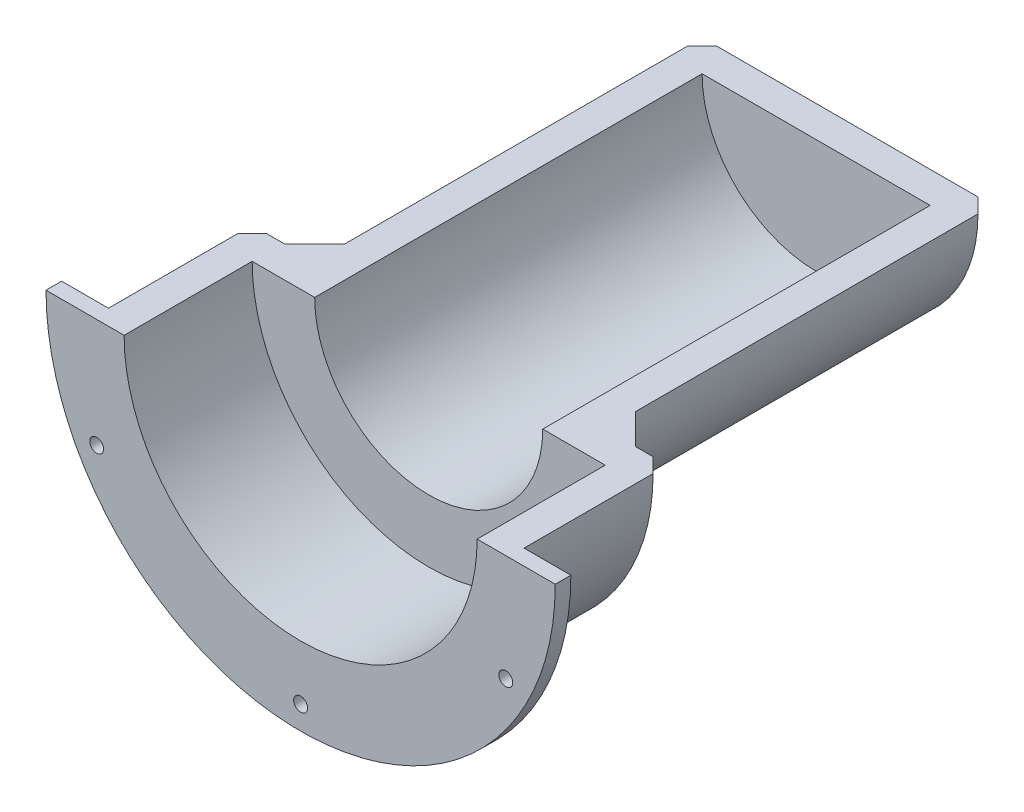
ISO-10303-21;
HEADER;
FILE_DESCRIPTION(('STEP AP214'),'2;1');
FILE_NAME('part.step','',(''),(''),'','','');
FILE_SCHEMA(('AUTOMOTIVE_DESIGN { 1 0 10303 214 1 1 1 1 }'));
ENDSEC;
DATA;
#1=APPLICATION_CONTEXT('core data for automotive mechanical design processes');
#2=APPLICATION_PROTOCOL_DEFINITION('international standard','automotive_design',2000,#1);
#3=PRODUCT_CONTEXT('',#1,'mechanical');
#4=PRODUCT('Part','Part','',(#3));
#5=PRODUCT_RELATED_PRODUCT_CATEGORY('part','',(#4));
#6=PRODUCT_DEFINITION_FORMATION('','',#4);
#7=PRODUCT_DEFINITION_CONTEXT('part definition',#1,'design');
#8=PRODUCT_DEFINITION('design','',#6,#7);
#9=PRODUCT_DEFINITION_SHAPE('','',#8);
#10=(LENGTH_UNIT() NAMED_UNIT(*) SI_UNIT(.MILLI.,.METRE.));
#11=(NAMED_UNIT(*) PLANE_ANGLE_UNIT() SI_UNIT($,.RADIAN.));
#12=(NAMED_UNIT(*) SI_UNIT($,.STERADIAN.) SOLID_ANGLE_UNIT());
#13=UNCERTAINTY_MEASURE_WITH_UNIT(LENGTH_MEASURE(1.E-05),#10,'distance_accuracy_value','');
#14=(GEOMETRIC_REPRESENTATION_CONTEXT(3) GLOBAL_UNCERTAINTY_ASSIGNED_CONTEXT((#13)) GLOBAL_UNIT_ASSIGNED_CONTEXT((#10,
#11,#12)) REPRESENTATION_CONTEXT('',''));
#15=CARTESIAN_POINT('',(0.,0.,0.));
#16=DIRECTION('',(0.,0.,1.));
#17=DIRECTION('',(1.,0.,0.));
#18=AXIS2_PLACEMENT_3D('',#15,#16,#17);
#19=CARTESIAN_POINT('',(0.,0.,25.908));
#20=DIRECTION('',(0.,0.,-1.));
#21=DIRECTION('',(-1.,0.,0.));
#22=AXIS2_PLACEMENT_3D('',#19,#20,#21);
#23=CYLINDRICAL_SURFACE('',#22,33.782);
#24=DIRECTION('',(0.,0.,-1.));
#25=VECTOR('',#24,1.);
#26=CARTESIAN_POINT('',(-33.782,0.,25.908));
#27=LINE('',#26,#25);
#28=CARTESIAN_POINT('',(-33.782,0.,23.368));
#29=VERTEX_POINT('',#28);
#30=CARTESIAN_POINT('',(-33.782,0.,2.38000000000003));
#31=VERTEX_POINT('',#30);
#32=EDGE_CURVE('E188',#29,#31,#27,.T.);
#33=ORIENTED_EDGE('',*,*,#32,.T.);
#34=CARTESIAN_POINT('',(0.,0.,2.38000000000003));
#35=DIRECTION('',(0.,0.,1.));
#36=DIRECTION('',(1.,0.,0.));
#37=AXIS2_PLACEMENT_3D('',#34,#35,#36);
#38=CIRCLE('',#37,33.782);
#39=CARTESIAN_POINT('',(33.782,0.,2.38000000000003));
#40=VERTEX_POINT('',#39);
#41=EDGE_CURVE('E259',#31,#40,#38,.T.);
#42=ORIENTED_EDGE('',*,*,#41,.T.);
#43=DIRECTION('',(0.,0.,-1.));
#44=VECTOR('',#43,1.);
#45=CARTESIAN_POINT('',(33.782,0.,25.908));
#46=LINE('',#45,#44);
#47=CARTESIAN_POINT('',(33.782,0.,23.368));
#48=VERTEX_POINT('',#47);
#49=EDGE_CURVE('E194',#48,#40,#46,.T.);
#50=ORIENTED_EDGE('',*,*,#49,.F.);
#51=CARTESIAN_POINT('',(0.,0.,23.368));
#52=DIRECTION('',(0.,0.,1.));
#53=DIRECTION('',(1.,0.,0.));
#54=AXIS2_PLACEMENT_3D('',#51,#52,#53);
#55=CIRCLE('',#54,33.782);
#56=EDGE_CURVE('E273',#29,#48,#55,.T.);
#57=ORIENTED_EDGE('',*,*,#56,.F.);
#58=EDGE_LOOP('',(#33,#42,#50,#57));
#59=FACE_BOUND('',#58,.T.);
#60=ADVANCED_FACE('F67',(#59),#23,.T.);
#61=CARTESIAN_POINT('',(0.,0.,5.08));
#62=DIRECTION('',(0.,0.,1.));
#63=DIRECTION('',(1.,0.,0.));
#64=AXIS2_PLACEMENT_3D('',#61,#62,#63);
#65=CYLINDRICAL_SURFACE('',#64,28.702);
#66=DIRECTION('',(0.,0.,1.));
#67=VECTOR('',#66,1.);
#68=CARTESIAN_POINT('',(-28.702,0.,5.08));
#69=LINE('',#68,#67);
#70=CARTESIAN_POINT('',(-28.702,0.,5.08));
#71=VERTEX_POINT('',#70);
#72=CARTESIAN_POINT('',(-28.702,0.,25.908));
#73=VERTEX_POINT('',#72);
#74=EDGE_CURVE('E172',#71,#73,#69,.T.);
#75=ORIENTED_EDGE('',*,*,#74,.T.);
#76=CARTESIAN_POINT('',(0.,0.,25.908));
#77=DIRECTION('',(0.,0.,1.));
#78=DIRECTION('',(1.,0.,0.));
#79=AXIS2_PLACEMENT_3D('',#76,#77,#78);
#80=CIRCLE('',#79,28.702);
#81=CARTESIAN_POINT('',(28.702,0.,25.908));
#82=VERTEX_POINT('',#81);
#83=EDGE_CURVE('E175',#73,#82,#80,.T.);
#84=ORIENTED_EDGE('',*,*,#83,.T.);
#85=DIRECTION('',(0.,0.,1.));
#86=VECTOR('',#85,1.);
#87=CARTESIAN_POINT('',(28.702,0.,5.08));
#88=LINE('',#87,#86);
#89=CARTESIAN_POINT('',(28.702,0.,5.08));
#90=VERTEX_POINT('',#89);
#91=EDGE_CURVE('E160',#90,#82,#88,.T.);
#92=ORIENTED_EDGE('',*,*,#91,.F.);
#93=CARTESIAN_POINT('',(0.,0.,5.08));
#94=DIRECTION('',(0.,0.,1.));
#95=DIRECTION('',(1.,0.,0.));
#96=AXIS2_PLACEMENT_3D('',#93,#94,#95);
#97=CIRCLE('',#96,28.702);
#98=EDGE_CURVE('E343',#71,#90,#97,.T.);
#99=ORIENTED_EDGE('',*,*,#98,.F.);
#100=EDGE_LOOP('',(#75,#84,#92,#99));
#101=FACE_BOUND('',#100,.T.);
#102=ADVANCED_FACE('F176',(#101),#65,.F.);
#103=CARTESIAN_POINT('',(0.,0.,-57.912));
#104=DIRECTION('',(0.,0.,1.));
#105=DIRECTION('',(1.,0.,0.));
#106=AXIS2_PLACEMENT_3D('',#103,#104,#105);
#107=CYLINDRICAL_SURFACE('',#106,18.542);
#108=CARTESIAN_POINT('',(0.,0.,5.08));
#109=DIRECTION('',(0.,0.,1.));
#110=DIRECTION('',(1.,0.,0.));
#111=AXIS2_PLACEMENT_3D('',#108,#109,#110);
#112=CIRCLE('',#111,18.542);
#113=CARTESIAN_POINT('',(18.542,0.,5.08));
#114=VERTEX_POINT('',#113);
#115=CARTESIAN_POINT('',(-18.542,0.,5.08));
#116=VERTEX_POINT('',#115);
#117=EDGE_CURVE('E226',#114,#116,#112,.F.);
#118=ORIENTED_EDGE('',*,*,#117,.F.);
#119=DIRECTION('',(0.,0.,1.));
#120=VECTOR('',#119,1.);
#121=CARTESIAN_POINT('',(18.542,0.,-57.912));
#122=LINE('',#121,#120);
#123=CARTESIAN_POINT('',(18.542,0.,-57.912));
#124=VERTEX_POINT('',#123);
#125=EDGE_CURVE('E211',#124,#114,#122,.T.);
#126=ORIENTED_EDGE('',*,*,#125,.F.);
#127=CARTESIAN_POINT('',(0.,0.,-57.912));
#128=DIRECTION('',(0.,0.,1.));
#129=DIRECTION('',(1.,0.,0.));
#130=AXIS2_PLACEMENT_3D('',#127,#128,#129);
#131=CIRCLE('',#130,18.542);
#132=CARTESIAN_POINT('',(-18.542,0.,-57.912));
#133=VERTEX_POINT('',#132);
#134=EDGE_CURVE('E204',#133,#124,#131,.T.);
#135=ORIENTED_EDGE('',*,*,#134,.F.);
#136=DIRECTION('',(0.,0.,1.));
#137=VECTOR('',#136,1.);
#138=CARTESIAN_POINT('',(-18.542,0.,-57.912));
#139=LINE('',#138,#137);
#140=EDGE_CURVE('E212',#133,#116,#139,.T.);
#141=ORIENTED_EDGE('',*,*,#140,.T.);
#142=EDGE_LOOP('',(#118,#126,#135,#141));
#143=FACE_BOUND('',#142,.T.);
#144=ADVANCED_FACE('F293',(#143),#107,.F.);
#145=CARTESIAN_POINT('',(0.,0.,-62.992));
#146=DIRECTION('',(0.,0.,1.));
#147=DIRECTION('',(1.,0.,0.));
#148=AXIS2_PLACEMENT_3D('',#145,#146,#147);
#149=CYLINDRICAL_SURFACE('',#148,23.622);
#150=DIRECTION('',(0.,0.,1.));
#151=VECTOR('',#150,1.);
#152=CARTESIAN_POINT('',(-23.622,0.,-62.992));
#153=LINE('',#152,#151);
#154=CARTESIAN_POINT('',(-23.622,0.,-60.612));
#155=VERTEX_POINT('',#154);
#156=CARTESIAN_POINT('',(-23.622,0.,-4.92000000000005));
#157=VERTEX_POINT('',#156);
#158=EDGE_CURVE('E222',#155,#157,#153,.T.);
#159=ORIENTED_EDGE('',*,*,#158,.F.);
#160=CARTESIAN_POINT('',(0.,0.,-60.612));
#161=DIRECTION('',(0.,0.,1.));
#162=DIRECTION('',(1.,0.,0.));
#163=AXIS2_PLACEMENT_3D('',#160,#161,#162);
#164=CIRCLE('',#163,23.622);
#165=CARTESIAN_POINT('',(23.622,0.,-60.612));
#166=VERTEX_POINT('',#165);
#167=EDGE_CURVE('E246',#155,#166,#164,.T.);
#168=ORIENTED_EDGE('',*,*,#167,.T.);
#169=DIRECTION('',(0.,0.,1.));
#170=VECTOR('',#169,1.);
#171=CARTESIAN_POINT('',(23.622,0.,-62.992));
#172=LINE('',#171,#170);
#173=CARTESIAN_POINT('',(23.622,0.,-4.92000000000005));
#174=VERTEX_POINT('',#173);
#175=EDGE_CURVE('E223',#166,#174,#172,.T.);
#176=ORIENTED_EDGE('',*,*,#175,.T.);
#177=CARTESIAN_POINT('',(0.,0.,-4.92000000000005));
#178=DIRECTION('',(0.,0.,1.));
#179=DIRECTION('',(1.,0.,0.));
#180=AXIS2_PLACEMENT_3D('',#177,#178,#179);
#181=CIRCLE('',#180,23.622);
#182=EDGE_CURVE('E235',#174,#157,#181,.F.);
#183=ORIENTED_EDGE('',*,*,#182,.T.);
#184=EDGE_LOOP('',(#159,#168,#176,#183));
#185=FACE_BOUND('',#184,.T.);
#186=ADVANCED_FACE('F306',(#185),#149,.T.);
#187=CARTESIAN_POINT('',(0.,0.,-62.992));
#188=DIRECTION('',(0.,-1.,0.));
#189=DIRECTION('',(0.,0.,-1.));
#190=AXIS2_PLACEMENT_3D('',#187,#188,#189);
#191=PLANE('',#190);
#192=ORIENTED_EDGE('',*,*,#49,.T.);
#193=DIRECTION('',(0.70710678118655,0.,0.707106781186545));
#194=VECTOR('',#193,1.);
#195=CARTESIAN_POINT('',(0.,0.,-31.4019999999998));
#196=LINE('',#195,#194);
#197=CARTESIAN_POINT('',(31.402,0.,0.));
#198=VERTEX_POINT('',#197);
#199=EDGE_CURVE('E77',#40,#198,#196,.F.);
#200=ORIENTED_EDGE('',*,*,#199,.T.);
#201=DIRECTION('',(-1.,0.,0.));
#202=VECTOR('',#201,1.);
#203=CARTESIAN_POINT('',(-33.782,0.,0.));
#204=LINE('',#203,#202);
#205=CARTESIAN_POINT('',(28.542,0.,0.));
#206=VERTEX_POINT('',#205);
#207=EDGE_CURVE('E196',#198,#206,#204,.T.);
#208=ORIENTED_EDGE('',*,*,#207,.T.);
#209=DIRECTION('',(0.707106781186544,0.,0.707106781186551));
#210=VECTOR('',#209,1.);
#211=CARTESIAN_POINT('',(0.,0.,-28.5420000000003));
#212=LINE('',#211,#210);
#213=EDGE_CURVE('E239',#206,#174,#212,.F.);
#214=ORIENTED_EDGE('',*,*,#213,.T.);
#215=ORIENTED_EDGE('',*,*,#175,.F.);
#216=DIRECTION('',(0.707106781186551,0.,0.707106781186544));
#217=VECTOR('',#216,1.);
#218=CARTESIAN_POINT('',(0.,0.,-84.2339999999998));
#219=LINE('',#218,#217);
#220=CARTESIAN_POINT('',(21.242,0.,-62.992));
#221=VERTEX_POINT('',#220);
#222=EDGE_CURVE('E253',#166,#221,#219,.F.);
#223=ORIENTED_EDGE('',*,*,#222,.T.);
#224=DIRECTION('',(1.,0.,0.));
#225=VECTOR('',#224,1.);
#226=CARTESIAN_POINT('',(0.,0.,-62.992));
#227=LINE('',#226,#225);
#228=CARTESIAN_POINT('',(-21.242,0.,-62.992));
#229=VERTEX_POINT('',#228);
#230=EDGE_CURVE('E216',#229,#221,#227,.T.);
#231=ORIENTED_EDGE('',*,*,#230,.F.);
#232=DIRECTION('',(0.707106781186551,0.,-0.707106781186544));
#233=VECTOR('',#232,1.);
#234=CARTESIAN_POINT('',(0.,0.,-84.2339999999998));
#235=LINE('',#234,#233);
#236=EDGE_CURVE('E250',#229,#155,#235,.F.);
#237=ORIENTED_EDGE('',*,*,#236,.T.);
#238=ORIENTED_EDGE('',*,*,#158,.T.);
#239=DIRECTION('',(0.707106781186544,0.,-0.707106781186551));
#240=VECTOR('',#239,1.);
#241=CARTESIAN_POINT('',(0.,0.,-28.5420000000003));
#242=LINE('',#241,#240);
#243=CARTESIAN_POINT('',(-28.542,0.,0.));
#244=VERTEX_POINT('',#243);
#245=EDGE_CURVE('E243',#157,#244,#242,.F.);
#246=ORIENTED_EDGE('',*,*,#245,.T.);
#247=CARTESIAN_POINT('',(-31.402,0.,0.));
#248=VERTEX_POINT('',#247);
#249=EDGE_CURVE('E200',#244,#248,#204,.T.);
#250=ORIENTED_EDGE('',*,*,#249,.T.);
#251=DIRECTION('',(0.70710678118655,0.,-0.707106781186545));
#252=VECTOR('',#251,1.);
#253=CARTESIAN_POINT('',(0.,0.,-31.4019999999998));
#254=LINE('',#253,#252);
#255=EDGE_CURVE('E263',#248,#31,#254,.F.);
#256=ORIENTED_EDGE('',*,*,#255,.T.);
#257=ORIENTED_EDGE('',*,*,#32,.F.);
#258=DIRECTION('',(-1.,0.,0.));
#259=VECTOR('',#258,1.);
#260=CARTESIAN_POINT('',(-41.402,0.,23.368));
#261=LINE('',#260,#259);
#262=CARTESIAN_POINT('',(-41.402,0.,23.368));
#263=VERTEX_POINT('',#262);
#264=EDGE_CURVE('E362',#29,#263,#261,.T.);
#265=ORIENTED_EDGE('',*,*,#264,.T.);
#266=DIRECTION('',(0.,0.,1.));
#267=VECTOR('',#266,1.);
#268=CARTESIAN_POINT('',(-41.402,0.,23.368));
#269=LINE('',#268,#267);
#270=CARTESIAN_POINT('',(-41.402,0.,25.908));
#271=VERTEX_POINT('',#270);
#272=EDGE_CURVE('E348',#263,#271,#269,.T.);
#273=ORIENTED_EDGE('',*,*,#272,.T.);
#274=DIRECTION('',(-1.,0.,0.));
#275=VECTOR('',#274,1.);
#276=CARTESIAN_POINT('',(-33.782,0.,25.908));
#277=LINE('',#276,#275);
#278=EDGE_CURVE('E189',#73,#271,#277,.T.);
#279=ORIENTED_EDGE('',*,*,#278,.F.);
#280=ORIENTED_EDGE('',*,*,#74,.F.);
#281=DIRECTION('',(-1.,0.,0.));
#282=VECTOR('',#281,1.);
#283=CARTESIAN_POINT('',(-28.702,0.,5.08));
#284=LINE('',#283,#282);
#285=EDGE_CURVE('E342',#116,#71,#284,.T.);
#286=ORIENTED_EDGE('',*,*,#285,.F.);
#287=ORIENTED_EDGE('',*,*,#140,.F.);
#288=DIRECTION('',(-1.,0.,0.));
#289=VECTOR('',#288,1.);
#290=CARTESIAN_POINT('',(-18.542,0.,-57.912));
#291=LINE('',#290,#289);
#292=EDGE_CURVE('E207',#124,#133,#291,.T.);
#293=ORIENTED_EDGE('',*,*,#292,.F.);
#294=ORIENTED_EDGE('',*,*,#125,.T.);
#295=EDGE_CURVE('E167',#90,#114,#284,.T.);
#296=ORIENTED_EDGE('',*,*,#295,.F.);
#297=ORIENTED_EDGE('',*,*,#91,.T.);
#298=CARTESIAN_POINT('',(41.402,0.,25.908));
#299=VERTEX_POINT('',#298);
#300=EDGE_CURVE('E164',#299,#82,#277,.T.);
#301=ORIENTED_EDGE('',*,*,#300,.F.);
#302=DIRECTION('',(0.,0.,1.));
#303=VECTOR('',#302,1.);
#304=CARTESIAN_POINT('',(41.402,0.,23.368));
#305=LINE('',#304,#303);
#306=CARTESIAN_POINT('',(41.402,0.,23.368));
#307=VERTEX_POINT('',#306);
#308=EDGE_CURVE('E349',#307,#299,#305,.T.);
#309=ORIENTED_EDGE('',*,*,#308,.F.);
#310=EDGE_CURVE('E352',#307,#48,#261,.T.);
#311=ORIENTED_EDGE('',*,*,#310,.T.);
#312=EDGE_LOOP('',(#192,#200,#208,#214,#215,#223,#231,#237,#238,#246,#250,#256,#257,#265,#273,
#279,#280,#286,#287,#293,#294,#296,#297,#301,#309,#311));
#313=FACE_BOUND('',#312,.T.);
#314=ADVANCED_FACE('F162',(#313),#191,.F.);
#315=CARTESIAN_POINT('',(0.,0.,-62.992));
#316=DIRECTION('',(0.,0.,1.));
#317=DIRECTION('',(1.,0.,0.));
#318=AXIS2_PLACEMENT_3D('',#315,#316,#317);
#319=PLANE('',#318);
#320=ORIENTED_EDGE('',*,*,#230,.T.);
#321=CARTESIAN_POINT('',(0.,0.,-62.992));
#322=DIRECTION('',(0.,0.,1.));
#323=DIRECTION('',(1.,0.,0.));
#324=AXIS2_PLACEMENT_3D('',#321,#322,#323);
#325=CIRCLE('',#324,21.242);
#326=EDGE_CURVE('E256',#221,#229,#325,.F.);
#327=ORIENTED_EDGE('',*,*,#326,.T.);
#328=EDGE_LOOP('',(#320,#327));
#329=FACE_BOUND('',#328,.T.);
#330=ADVANCED_FACE('F302',(#329),#319,.F.);
#331=CARTESIAN_POINT('',(0.,0.,-57.912));
#332=DIRECTION('',(0.,0.,1.));
#333=DIRECTION('',(1.,0.,0.));
#334=AXIS2_PLACEMENT_3D('',#331,#332,#333);
#335=PLANE('',#334);
#336=ORIENTED_EDGE('',*,*,#134,.T.);
#337=ORIENTED_EDGE('',*,*,#292,.T.);
#338=EDGE_LOOP('',(#336,#337));
#339=FACE_BOUND('',#338,.T.);
#340=ADVANCED_FACE('F299',(#339),#335,.T.);
#341=CARTESIAN_POINT('',(0.,0.,25.908));
#342=DIRECTION('',(0.,0.,1.));
#343=DIRECTION('',(1.,0.,0.));
#344=AXIS2_PLACEMENT_3D('',#341,#342,#343);
#345=PLANE('',#344);
#346=CARTESIAN_POINT('',(-33.1564254473108,-17.7146807918439,25.908));
#347=DIRECTION('',(0.,0.,1.));
#348=DIRECTION('',(1.,0.,0.));
#349=AXIS2_PLACEMENT_3D('',#346,#347,#348);
#350=CIRCLE('',#349,1.1303);
#351=CARTESIAN_POINT('',(-32.0261254473108,-17.7146807918439,25.908));
#352=VERTEX_POINT('',#351);
#353=EDGE_CURVE('E382',#352,#352,#350,.T.);
#354=ORIENTED_EDGE('',*,*,#353,.F.);
#355=EDGE_LOOP('',(#354));
#356=FACE_BOUND('',#355,.T.);
#357=CARTESIAN_POINT('',(33.3594053164859,-17.3294125962311,25.908));
#358=DIRECTION('',(0.,0.,1.));
#359=DIRECTION('',(1.,0.,0.));
#360=AXIS2_PLACEMENT_3D('',#357,#358,#359);
#361=CIRCLE('',#360,1.1303);
#362=CARTESIAN_POINT('',(34.4897053164859,-17.3294125962311,25.908));
#363=VERTEX_POINT('',#362);
#364=EDGE_CURVE('E378',#363,#363,#361,.T.);
#365=ORIENTED_EDGE('',*,*,#364,.F.);
#366=EDGE_LOOP('',(#365));
#367=FACE_BOUND('',#366,.T.);
#368=CARTESIAN_POINT('',(0.,-37.592,25.908));
#369=DIRECTION('',(0.,0.,-1.));
#370=DIRECTION('',(-1.,0.,0.));
#371=AXIS2_PLACEMENT_3D('',#368,#369,#370);
#372=CIRCLE('',#371,1.1303);
#373=CARTESIAN_POINT('',(-1.1303,-37.592,25.908));
#374=VERTEX_POINT('',#373);
#375=EDGE_CURVE('E182',#374,#374,#372,.T.);
#376=ORIENTED_EDGE('',*,*,#375,.T.);
#377=EDGE_LOOP('',(#376));
#378=FACE_BOUND('',#377,.T.);
#379=ORIENTED_EDGE('',*,*,#83,.F.);
#380=ORIENTED_EDGE('',*,*,#278,.T.);
#381=CARTESIAN_POINT('',(0.,0.,25.908));
#382=DIRECTION('',(0.,0.,1.));
#383=DIRECTION('',(1.,0.,0.));
#384=AXIS2_PLACEMENT_3D('',#381,#382,#383);
#385=CIRCLE('',#384,41.402);
#386=EDGE_CURVE('E181',#271,#299,#385,.T.);
#387=ORIENTED_EDGE('',*,*,#386,.T.);
#388=ORIENTED_EDGE('',*,*,#300,.T.);
#389=EDGE_LOOP('',(#379,#380,#387,#388));
#390=FACE_BOUND('',#389,.T.);
#391=ADVANCED_FACE('F185',(#356,#367,#378,#390),#345,.T.);
#392=CARTESIAN_POINT('',(0.,0.,0.));
#393=DIRECTION('',(0.,0.,1.));
#394=DIRECTION('',(1.,0.,0.));
#395=AXIS2_PLACEMENT_3D('',#392,#393,#394);
#396=PLANE('',#395);
#397=ORIENTED_EDGE('',*,*,#207,.F.);
#398=CARTESIAN_POINT('',(0.,0.,0.));
#399=DIRECTION('',(0.,0.,1.));
#400=DIRECTION('',(1.,0.,0.));
#401=AXIS2_PLACEMENT_3D('',#398,#399,#400);
#402=CIRCLE('',#401,31.402);
#403=EDGE_CURVE('E12',#198,#248,#402,.F.);
#404=ORIENTED_EDGE('',*,*,#403,.T.);
#405=ORIENTED_EDGE('',*,*,#249,.F.);
#406=CARTESIAN_POINT('',(0.,0.,0.));
#407=DIRECTION('',(0.,0.,1.));
#408=DIRECTION('',(1.,0.,0.));
#409=AXIS2_PLACEMENT_3D('',#406,#407,#408);
#410=CIRCLE('',#409,28.542);
#411=EDGE_CURVE('E231',#244,#206,#410,.T.);
#412=ORIENTED_EDGE('',*,*,#411,.T.);
#413=EDGE_LOOP('',(#397,#404,#405,#412));
#414=FACE_BOUND('',#413,.T.);
#415=ADVANCED_FACE('F297',(#414),#396,.F.);
#416=CARTESIAN_POINT('',(0.,0.,5.08));
#417=DIRECTION('',(0.,0.,1.));
#418=DIRECTION('',(1.,0.,0.));
#419=AXIS2_PLACEMENT_3D('',#416,#417,#418);
#420=PLANE('',#419);
#421=ORIENTED_EDGE('',*,*,#117,.T.);
#422=ORIENTED_EDGE('',*,*,#285,.T.);
#423=ORIENTED_EDGE('',*,*,#98,.T.);
#424=ORIENTED_EDGE('',*,*,#295,.T.);
#425=EDGE_LOOP('',(#421,#422,#423,#424));
#426=FACE_BOUND('',#425,.T.);
#427=ADVANCED_FACE('F408',(#426),#420,.T.);
#428=CARTESIAN_POINT('',(0.,0.,23.368));
#429=DIRECTION('',(0.,0.,1.));
#430=DIRECTION('',(1.,0.,0.));
#431=AXIS2_PLACEMENT_3D('',#428,#429,#430);
#432=PLANE('',#431);
#433=CARTESIAN_POINT('',(-33.1564254473108,-17.7146807918439,23.368));
#434=DIRECTION('',(0.,0.,1.));
#435=DIRECTION('',(1.,0.,0.));
#436=AXIS2_PLACEMENT_3D('',#433,#434,#435);
#437=CIRCLE('',#436,1.1303);
#438=CARTESIAN_POINT('',(-32.0261254473108,-17.7146807918439,23.368));
#439=VERTEX_POINT('',#438);
#440=EDGE_CURVE('E370',#439,#439,#437,.T.);
#441=ORIENTED_EDGE('',*,*,#440,.T.);
#442=EDGE_LOOP('',(#441));
#443=FACE_BOUND('',#442,.T.);
#444=CARTESIAN_POINT('',(33.3594053164859,-17.3294125962311,23.368));
#445=DIRECTION('',(0.,0.,1.));
#446=DIRECTION('',(1.,0.,0.));
#447=AXIS2_PLACEMENT_3D('',#444,#445,#446);
#448=CIRCLE('',#447,1.1303);
#449=CARTESIAN_POINT('',(34.4897053164859,-17.3294125962311,23.368));
#450=VERTEX_POINT('',#449);
#451=EDGE_CURVE('E374',#450,#450,#448,.T.);
#452=ORIENTED_EDGE('',*,*,#451,.T.);
#453=EDGE_LOOP('',(#452));
#454=FACE_BOUND('',#453,.T.);
#455=CARTESIAN_POINT('',(0.,-37.592,23.368));
#456=DIRECTION('',(0.,0.,-1.));
#457=DIRECTION('',(-1.,0.,0.));
#458=AXIS2_PLACEMENT_3D('',#455,#456,#457);
#459=CIRCLE('',#458,1.1303);
#460=CARTESIAN_POINT('',(-1.1303,-37.592,23.368));
#461=VERTEX_POINT('',#460);
#462=EDGE_CURVE('E366',#461,#461,#459,.T.);
#463=ORIENTED_EDGE('',*,*,#462,.F.);
#464=EDGE_LOOP('',(#463));
#465=FACE_BOUND('',#464,.T.);
#466=ORIENTED_EDGE('',*,*,#264,.F.);
#467=ORIENTED_EDGE('',*,*,#56,.T.);
#468=ORIENTED_EDGE('',*,*,#310,.F.);
#469=CARTESIAN_POINT('',(0.,0.,23.368));
#470=DIRECTION('',(0.,0.,1.));
#471=DIRECTION('',(1.,0.,0.));
#472=AXIS2_PLACEMENT_3D('',#469,#470,#471);
#473=CIRCLE('',#472,41.402);
#474=EDGE_CURVE('E358',#263,#307,#473,.T.);
#475=ORIENTED_EDGE('',*,*,#474,.F.);
#476=EDGE_LOOP('',(#466,#467,#468,#475));
#477=FACE_BOUND('',#476,.T.);
#478=ADVANCED_FACE('F329',(#443,#454,#465,#477),#432,.F.);
#479=CARTESIAN_POINT('',(0.,0.,23.368));
#480=DIRECTION('',(0.,0.,1.));
#481=DIRECTION('',(1.,0.,0.));
#482=AXIS2_PLACEMENT_3D('',#479,#480,#481);
#483=CYLINDRICAL_SURFACE('',#482,41.402);
#484=ORIENTED_EDGE('',*,*,#386,.F.);
#485=ORIENTED_EDGE('',*,*,#272,.F.);
#486=ORIENTED_EDGE('',*,*,#474,.T.);
#487=ORIENTED_EDGE('',*,*,#308,.T.);
#488=EDGE_LOOP('',(#484,#485,#486,#487));
#489=FACE_BOUND('',#488,.T.);
#490=ADVANCED_FACE('F320',(#489),#483,.T.);
#491=CARTESIAN_POINT('',(0.,0.,0.));
#492=DIRECTION('',(0.,0.,1.));
#493=DIRECTION('',(1.,0.,0.));
#494=AXIS2_PLACEMENT_3D('',#491,#492,#493);
#495=CONICAL_SURFACE('',#494,28.542,0.785398163397443);
#496=ORIENTED_EDGE('',*,*,#245,.F.);
#497=ORIENTED_EDGE('',*,*,#182,.F.);
#498=ORIENTED_EDGE('',*,*,#213,.F.);
#499=ORIENTED_EDGE('',*,*,#411,.F.);
#500=EDGE_LOOP('',(#496,#497,#498,#499));
#501=FACE_BOUND('',#500,.T.);
#502=ADVANCED_FACE('F285',(#501),#495,.T.);
#503=CARTESIAN_POINT('',(0.,0.,-60.612));
#504=DIRECTION('',(0.,0.,1.));
#505=DIRECTION('',(1.,0.,0.));
#506=AXIS2_PLACEMENT_3D('',#503,#504,#505);
#507=CONICAL_SURFACE('',#506,23.622,0.785398163397453);
#508=ORIENTED_EDGE('',*,*,#236,.F.);
#509=ORIENTED_EDGE('',*,*,#326,.F.);
#510=ORIENTED_EDGE('',*,*,#222,.F.);
#511=ORIENTED_EDGE('',*,*,#167,.F.);
#512=EDGE_LOOP('',(#508,#509,#510,#511));
#513=FACE_BOUND('',#512,.T.);
#514=ADVANCED_FACE('F276',(#513),#507,.T.);
#515=CARTESIAN_POINT('',(0.,0.,2.38000000000003));
#516=DIRECTION('',(0.,0.,1.));
#517=DIRECTION('',(1.,0.,0.));
#518=AXIS2_PLACEMENT_3D('',#515,#516,#517);
#519=CONICAL_SURFACE('',#518,33.782,0.785398163397451);
#520=ORIENTED_EDGE('',*,*,#255,.F.);
#521=ORIENTED_EDGE('',*,*,#403,.F.);
#522=ORIENTED_EDGE('',*,*,#199,.F.);
#523=ORIENTED_EDGE('',*,*,#41,.F.);
#524=EDGE_LOOP('',(#520,#521,#522,#523));
#525=FACE_BOUND('',#524,.T.);
#526=ADVANCED_FACE('F70',(#525),#519,.T.);
#527=CARTESIAN_POINT('',(0.,-37.592,25.908));
#528=DIRECTION('',(0.,0.,-1.));
#529=DIRECTION('',(-1.,0.,0.));
#530=AXIS2_PLACEMENT_3D('',#527,#528,#529);
#531=CYLINDRICAL_SURFACE('',#530,1.1303);
#532=ORIENTED_EDGE('',*,*,#375,.F.);
#533=EDGE_LOOP('',(#532));
#534=FACE_BOUND('',#533,.T.);
#535=ORIENTED_EDGE('',*,*,#462,.T.);
#536=EDGE_LOOP('',(#535));
#537=FACE_BOUND('',#536,.T.);
#538=ADVANCED_FACE('F275',(#534,#537),#531,.F.);
#539=CARTESIAN_POINT('',(33.3594053164859,-17.3294125962311,23.368));
#540=DIRECTION('',(0.,0.,1.));
#541=DIRECTION('',(1.,0.,0.));
#542=AXIS2_PLACEMENT_3D('',#539,#540,#541);
#543=CYLINDRICAL_SURFACE('',#542,1.1303);
#544=ORIENTED_EDGE('',*,*,#451,.F.);
#545=EDGE_LOOP('',(#544));
#546=FACE_BOUND('',#545,.T.);
#547=ORIENTED_EDGE('',*,*,#364,.T.);
#548=EDGE_LOOP('',(#547));
#549=FACE_BOUND('',#548,.T.);
#550=ADVANCED_FACE('F281',(#546,#549),#543,.F.);
#551=CARTESIAN_POINT('',(-33.1564254473108,-17.7146807918439,23.368));
#552=DIRECTION('',(0.,0.,1.));
#553=DIRECTION('',(1.,0.,0.));
#554=AXIS2_PLACEMENT_3D('',#551,#552,#553);
#555=CYLINDRICAL_SURFACE('',#554,1.1303);
#556=ORIENTED_EDGE('',*,*,#440,.F.);
#557=EDGE_LOOP('',(#556));
#558=FACE_BOUND('',#557,.T.);
#559=ORIENTED_EDGE('',*,*,#353,.T.);
#560=EDGE_LOOP('',(#559));
#561=FACE_BOUND('',#560,.T.);
#562=ADVANCED_FACE('F392',(#558,#561),#555,.F.);
#563=CLOSED_SHELL('',(#60,#102,#144,#186,#314,#330,#340,#391,#415,#427,#478,#490,#502,#514,#526,
#538,#550,#562));
#564=MANIFOLD_SOLID_BREP('B2',#563);
#565=ADVANCED_BREP_SHAPE_REPRESENTATION('',(#18,#564),#14);
#566=SHAPE_DEFINITION_REPRESENTATION(#9,#565);
ENDSEC;
END-ISO-10303-21;
